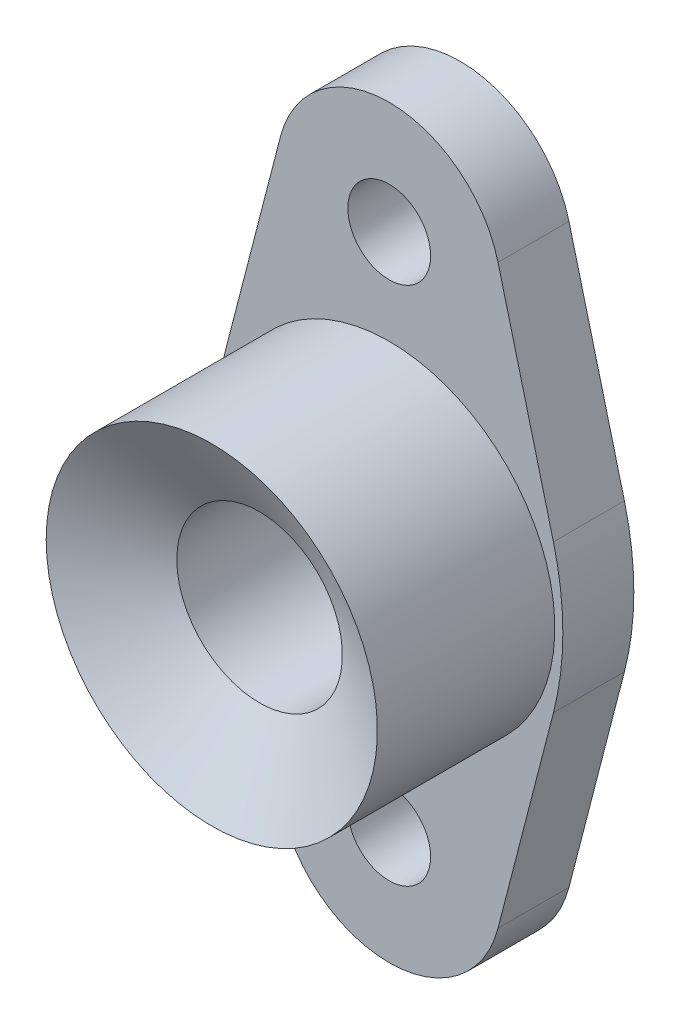
ISO-10303-21;
HEADER;
FILE_DESCRIPTION(('STEP AP214'),'2;1');
FILE_NAME('part.step','',(''),(''),'','','');
FILE_SCHEMA(('AUTOMOTIVE_DESIGN { 1 0 10303 214 1 1 1 1 }'));
ENDSEC;
DATA;
#1=APPLICATION_CONTEXT('core data for automotive mechanical design processes');
#2=APPLICATION_PROTOCOL_DEFINITION('international standard','automotive_design',2000,#1);
#3=PRODUCT_CONTEXT('',#1,'mechanical');
#4=PRODUCT('Part','Part','',(#3));
#5=PRODUCT_RELATED_PRODUCT_CATEGORY('part','',(#4));
#6=PRODUCT_DEFINITION_FORMATION('','',#4);
#7=PRODUCT_DEFINITION_CONTEXT('part definition',#1,'design');
#8=PRODUCT_DEFINITION('design','',#6,#7);
#9=PRODUCT_DEFINITION_SHAPE('','',#8);
#10=(LENGTH_UNIT() NAMED_UNIT(*) SI_UNIT(.MILLI.,.METRE.));
#11=(NAMED_UNIT(*) PLANE_ANGLE_UNIT() SI_UNIT($,.RADIAN.));
#12=(NAMED_UNIT(*) SI_UNIT($,.STERADIAN.) SOLID_ANGLE_UNIT());
#13=UNCERTAINTY_MEASURE_WITH_UNIT(LENGTH_MEASURE(1.E-05),#10,'distance_accuracy_value','');
#14=(GEOMETRIC_REPRESENTATION_CONTEXT(3) GLOBAL_UNCERTAINTY_ASSIGNED_CONTEXT((#13)) GLOBAL_UNIT_ASSIGNED_CONTEXT((#10,
#11,#12)) REPRESENTATION_CONTEXT('',''));
#15=CARTESIAN_POINT('',(0.,0.,0.));
#16=DIRECTION('',(0.,0.,1.));
#17=DIRECTION('',(1.,0.,0.));
#18=AXIS2_PLACEMENT_3D('',#15,#16,#17);
#19=CARTESIAN_POINT('',(0.,44.,12.));
#20=DIRECTION('',(0.,0.,1.));
#21=DIRECTION('',(1.,0.,0.));
#22=AXIS2_PLACEMENT_3D('',#19,#20,#21);
#23=PLANE('',#22);
#24=CARTESIAN_POINT('',(0.,0.,12.));
#25=DIRECTION('',(0.,0.,-1.));
#26=DIRECTION('',(-1.,0.,0.));
#27=AXIS2_PLACEMENT_3D('',#24,#25,#26);
#28=CIRCLE('',#27,28.);
#29=CARTESIAN_POINT('',(-28.,0.,12.));
#30=VERTEX_POINT('',#29);
#31=EDGE_CURVE('E190',#30,#30,#28,.T.);
#32=ORIENTED_EDGE('',*,*,#31,.T.);
#33=EDGE_LOOP('',(#32));
#34=FACE_BOUND('',#33,.T.);
#35=CARTESIAN_POINT('',(0.,-44.,12.));
#36=DIRECTION('',(0.,0.,1.));
#37=DIRECTION('',(1.,0.,0.));
#38=AXIS2_PLACEMENT_3D('',#35,#36,#37);
#39=CIRCLE('',#38,7.);
#40=CARTESIAN_POINT('',(7.00000000000001,-44.,12.));
#41=VERTEX_POINT('',#40);
#42=EDGE_CURVE('E179',#41,#41,#39,.T.);
#43=ORIENTED_EDGE('',*,*,#42,.F.);
#44=EDGE_LOOP('',(#43));
#45=FACE_BOUND('',#44,.T.);
#46=DIRECTION('',(-0.250300348874614,-0.968168237112356,0.));
#47=VECTOR('',#46,1.);
#48=CARTESIAN_POINT('',(-18.3951965051348,48.7557066286177,12.));
#49=LINE('',#48,#47);
#50=CARTESIAN_POINT('',(-18.3951965051348,48.7557066286177,12.));
#51=VERTEX_POINT('',#50);
#52=CARTESIAN_POINT('',(-27.7644949376973,12.5150174437307,12.));
#53=VERTEX_POINT('',#52);
#54=EDGE_CURVE('E98',#51,#53,#49,.T.);
#55=ORIENTED_EDGE('',*,*,#54,.T.);
#56=CARTESIAN_POINT('',(20.6439169179205,0.,12.));
#57=DIRECTION('',(0.,0.,1.));
#58=DIRECTION('',(1.,0.,0.));
#59=AXIS2_PLACEMENT_3D('',#56,#57,#58);
#60=CIRCLE('',#59,50.);
#61=CARTESIAN_POINT('',(-27.7644949376973,-12.5150174437307,12.));
#62=VERTEX_POINT('',#61);
#63=EDGE_CURVE('E138',#53,#62,#60,.T.);
#64=ORIENTED_EDGE('',*,*,#63,.T.);
#65=DIRECTION('',(0.250300348874614,-0.968168237112356,0.));
#66=VECTOR('',#65,1.);
#67=CARTESIAN_POINT('',(-31.,0.,12.));
#68=LINE('',#67,#66);
#69=CARTESIAN_POINT('',(-18.3951965051347,-48.7557066286177,12.));
#70=VERTEX_POINT('',#69);
#71=EDGE_CURVE('E108',#62,#70,#68,.T.);
#72=ORIENTED_EDGE('',*,*,#71,.T.);
#73=CARTESIAN_POINT('',(0.,-44.,12.));
#74=DIRECTION('',(0.,0.,1.));
#75=DIRECTION('',(1.,0.,0.));
#76=AXIS2_PLACEMENT_3D('',#73,#74,#75);
#77=CIRCLE('',#76,19.);
#78=CARTESIAN_POINT('',(18.3951965051348,-48.7557066286177,12.));
#79=VERTEX_POINT('',#78);
#80=EDGE_CURVE('E173',#70,#79,#77,.T.);
#81=ORIENTED_EDGE('',*,*,#80,.T.);
#82=DIRECTION('',(0.250300348874614,0.968168237112356,0.));
#83=VECTOR('',#82,1.);
#84=CARTESIAN_POINT('',(31.,0.,12.));
#85=LINE('',#84,#83);
#86=CARTESIAN_POINT('',(27.7644949376973,-12.5150174437307,12.));
#87=VERTEX_POINT('',#86);
#88=EDGE_CURVE('E160',#79,#87,#85,.T.);
#89=ORIENTED_EDGE('',*,*,#88,.T.);
#90=CARTESIAN_POINT('',(-20.6439169179204,0.,12.));
#91=DIRECTION('',(0.,0.,1.));
#92=DIRECTION('',(1.,0.,0.));
#93=AXIS2_PLACEMENT_3D('',#90,#91,#92);
#94=CIRCLE('',#93,50.);
#95=CARTESIAN_POINT('',(27.7644949376973,12.5150174437307,12.));
#96=VERTEX_POINT('',#95);
#97=EDGE_CURVE('E48',#87,#96,#94,.T.);
#98=ORIENTED_EDGE('',*,*,#97,.T.);
#99=DIRECTION('',(-0.250300348874614,0.968168237112356,0.));
#100=VECTOR('',#99,1.);
#101=CARTESIAN_POINT('',(18.3951965051348,48.7557066286177,12.));
#102=LINE('',#101,#100);
#103=CARTESIAN_POINT('',(18.3951965051348,48.7557066286177,12.));
#104=VERTEX_POINT('',#103);
#105=EDGE_CURVE('E113',#96,#104,#102,.T.);
#106=ORIENTED_EDGE('',*,*,#105,.T.);
#107=CARTESIAN_POINT('',(0.,44.,12.));
#108=DIRECTION('',(0.,0.,1.));
#109=DIRECTION('',(1.,0.,0.));
#110=AXIS2_PLACEMENT_3D('',#107,#108,#109);
#111=CIRCLE('',#110,19.);
#112=EDGE_CURVE('E109',#104,#51,#111,.T.);
#113=ORIENTED_EDGE('',*,*,#112,.T.);
#114=EDGE_LOOP('',(#55,#64,#72,#81,#89,#98,#106,#113));
#115=FACE_BOUND('',#114,.T.);
#116=CARTESIAN_POINT('',(0.,44.,12.));
#117=DIRECTION('',(0.,0.,1.));
#118=DIRECTION('',(1.,0.,0.));
#119=AXIS2_PLACEMENT_3D('',#116,#117,#118);
#120=CIRCLE('',#119,7.);
#121=CARTESIAN_POINT('',(7.,44.,12.));
#122=VERTEX_POINT('',#121);
#123=EDGE_CURVE('E170',#122,#122,#120,.T.);
#124=ORIENTED_EDGE('',*,*,#123,.F.);
#125=EDGE_LOOP('',(#124));
#126=FACE_BOUND('',#125,.T.);
#127=ADVANCED_FACE('F33',(#34,#45,#115,#126),#23,.T.);
#128=CARTESIAN_POINT('',(0.,44.,0.));
#129=DIRECTION('',(0.,0.,1.));
#130=DIRECTION('',(1.,0.,0.));
#131=AXIS2_PLACEMENT_3D('',#128,#129,#130);
#132=PLANE('',#131);
#133=DIRECTION('',(0.250300348874614,-0.968168237112356,0.));
#134=VECTOR('',#133,1.);
#135=CARTESIAN_POINT('',(-31.,0.,0.));
#136=LINE('',#135,#134);
#137=CARTESIAN_POINT('',(-27.7644949376973,-12.5150174437307,0.));
#138=VERTEX_POINT('',#137);
#139=CARTESIAN_POINT('',(-18.3951965051347,-48.7557066286177,0.));
#140=VERTEX_POINT('',#139);
#141=EDGE_CURVE('E164',#138,#140,#136,.T.);
#142=ORIENTED_EDGE('',*,*,#141,.F.);
#143=CARTESIAN_POINT('',(20.6439169179205,0.,0.));
#144=DIRECTION('',(0.,0.,1.));
#145=DIRECTION('',(1.,0.,0.));
#146=AXIS2_PLACEMENT_3D('',#143,#144,#145);
#147=CIRCLE('',#146,50.);
#148=CARTESIAN_POINT('',(-27.7644949376973,12.5150174437307,0.));
#149=VERTEX_POINT('',#148);
#150=EDGE_CURVE('E134',#138,#149,#147,.F.);
#151=ORIENTED_EDGE('',*,*,#150,.T.);
#152=DIRECTION('',(-0.250300348874614,-0.968168237112356,0.));
#153=VECTOR('',#152,1.);
#154=CARTESIAN_POINT('',(-18.3951965051348,48.7557066286177,0.));
#155=LINE('',#154,#153);
#156=CARTESIAN_POINT('',(-18.3951965051348,48.7557066286177,0.));
#157=VERTEX_POINT('',#156);
#158=EDGE_CURVE('E165',#157,#149,#155,.T.);
#159=ORIENTED_EDGE('',*,*,#158,.F.);
#160=CARTESIAN_POINT('',(0.,44.,0.));
#161=DIRECTION('',(0.,0.,1.));
#162=DIRECTION('',(1.,0.,0.));
#163=AXIS2_PLACEMENT_3D('',#160,#161,#162);
#164=CIRCLE('',#163,19.);
#165=CARTESIAN_POINT('',(18.3951965051348,48.7557066286177,0.));
#166=VERTEX_POINT('',#165);
#167=EDGE_CURVE('E121',#166,#157,#164,.T.);
#168=ORIENTED_EDGE('',*,*,#167,.F.);
#169=DIRECTION('',(-0.250300348874614,0.968168237112356,0.));
#170=VECTOR('',#169,1.);
#171=CARTESIAN_POINT('',(18.3951965051348,48.7557066286177,0.));
#172=LINE('',#171,#170);
#173=CARTESIAN_POINT('',(27.7644949376973,12.5150174437307,0.));
#174=VERTEX_POINT('',#173);
#175=EDGE_CURVE('E117',#174,#166,#172,.T.);
#176=ORIENTED_EDGE('',*,*,#175,.F.);
#177=CARTESIAN_POINT('',(-20.6439169179204,0.,0.));
#178=DIRECTION('',(0.,0.,1.));
#179=DIRECTION('',(1.,0.,0.));
#180=AXIS2_PLACEMENT_3D('',#177,#178,#179);
#181=CIRCLE('',#180,50.);
#182=CARTESIAN_POINT('',(27.7644949376973,-12.5150174437307,0.));
#183=VERTEX_POINT('',#182);
#184=EDGE_CURVE('E126',#174,#183,#181,.F.);
#185=ORIENTED_EDGE('',*,*,#184,.T.);
#186=DIRECTION('',(0.250300348874614,0.968168237112356,0.));
#187=VECTOR('',#186,1.);
#188=CARTESIAN_POINT('',(31.,0.,0.));
#189=LINE('',#188,#187);
#190=CARTESIAN_POINT('',(18.3951965051348,-48.7557066286177,0.));
#191=VERTEX_POINT('',#190);
#192=EDGE_CURVE('E150',#191,#183,#189,.T.);
#193=ORIENTED_EDGE('',*,*,#192,.F.);
#194=CARTESIAN_POINT('',(0.,-44.,0.));
#195=DIRECTION('',(0.,0.,1.));
#196=DIRECTION('',(1.,0.,0.));
#197=AXIS2_PLACEMENT_3D('',#194,#195,#196);
#198=CIRCLE('',#197,19.);
#199=EDGE_CURVE('E152',#140,#191,#198,.T.);
#200=ORIENTED_EDGE('',*,*,#199,.F.);
#201=EDGE_LOOP('',(#142,#151,#159,#168,#176,#185,#193,#200));
#202=FACE_BOUND('',#201,.T.);
#203=CARTESIAN_POINT('',(0.,44.,0.));
#204=DIRECTION('',(0.,0.,1.));
#205=DIRECTION('',(1.,0.,0.));
#206=AXIS2_PLACEMENT_3D('',#203,#204,#205);
#207=CIRCLE('',#206,7.);
#208=CARTESIAN_POINT('',(7.,44.,0.));
#209=VERTEX_POINT('',#208);
#210=EDGE_CURVE('E176',#209,#209,#207,.T.);
#211=ORIENTED_EDGE('',*,*,#210,.T.);
#212=EDGE_LOOP('',(#211));
#213=FACE_BOUND('',#212,.T.);
#214=CARTESIAN_POINT('',(0.,-44.,0.));
#215=DIRECTION('',(0.,0.,1.));
#216=DIRECTION('',(1.,0.,0.));
#217=AXIS2_PLACEMENT_3D('',#214,#215,#216);
#218=CIRCLE('',#217,7.);
#219=CARTESIAN_POINT('',(7.00000000000001,-44.,0.));
#220=VERTEX_POINT('',#219);
#221=EDGE_CURVE('E182',#220,#220,#218,.T.);
#222=ORIENTED_EDGE('',*,*,#221,.T.);
#223=EDGE_LOOP('',(#222));
#224=FACE_BOUND('',#223,.T.);
#225=CARTESIAN_POINT('',(0.,0.,0.));
#226=DIRECTION('',(0.,0.,1.));
#227=DIRECTION('',(1.,0.,0.));
#228=AXIS2_PLACEMENT_3D('',#225,#226,#227);
#229=CIRCLE('',#228,14.);
#230=CARTESIAN_POINT('',(14.,0.,0.));
#231=VERTEX_POINT('',#230);
#232=EDGE_CURVE('E185',#231,#231,#229,.T.);
#233=ORIENTED_EDGE('',*,*,#232,.T.);
#234=EDGE_LOOP('',(#233));
#235=FACE_BOUND('',#234,.T.);
#236=ADVANCED_FACE('F147',(#202,#213,#224,#235),#132,.F.);
#237=CARTESIAN_POINT('',(0.,44.,12.));
#238=DIRECTION('',(0.,0.,-1.));
#239=DIRECTION('',(-1.,0.,0.));
#240=AXIS2_PLACEMENT_3D('',#237,#238,#239);
#241=CYLINDRICAL_SURFACE('',#240,19.);
#242=ORIENTED_EDGE('',*,*,#167,.T.);
#243=DIRECTION('',(0.,0.,-1.));
#244=VECTOR('',#243,1.);
#245=CARTESIAN_POINT('',(-18.3951965051348,48.7557066286177,12.));
#246=LINE('',#245,#244);
#247=EDGE_CURVE('E103',#51,#157,#246,.T.);
#248=ORIENTED_EDGE('',*,*,#247,.F.);
#249=ORIENTED_EDGE('',*,*,#112,.F.);
#250=DIRECTION('',(0.,0.,-1.));
#251=VECTOR('',#250,1.);
#252=CARTESIAN_POINT('',(18.3951965051348,48.7557066286177,12.));
#253=LINE('',#252,#251);
#254=EDGE_CURVE('E156',#104,#166,#253,.T.);
#255=ORIENTED_EDGE('',*,*,#254,.T.);
#256=EDGE_LOOP('',(#242,#248,#249,#255));
#257=FACE_BOUND('',#256,.T.);
#258=ADVANCED_FACE('F119',(#257),#241,.T.);
#259=CARTESIAN_POINT('',(-18.3951965051348,48.7557066286177,12.));
#260=DIRECTION('',(0.968168237112356,-0.250300348874614,0.));
#261=DIRECTION('',(0.250300348874614,0.968168237112356,0.));
#262=AXIS2_PLACEMENT_3D('',#259,#260,#261);
#263=PLANE('',#262);
#264=ORIENTED_EDGE('',*,*,#158,.T.);
#265=DIRECTION('',(0.,0.,-1.));
#266=VECTOR('',#265,1.);
#267=CARTESIAN_POINT('',(-27.7644949376973,12.5150174437307,12.));
#268=LINE('',#267,#266);
#269=EDGE_CURVE('E106',#149,#53,#268,.F.);
#270=ORIENTED_EDGE('',*,*,#269,.T.);
#271=ORIENTED_EDGE('',*,*,#54,.F.);
#272=ORIENTED_EDGE('',*,*,#247,.T.);
#273=EDGE_LOOP('',(#264,#270,#271,#272));
#274=FACE_BOUND('',#273,.T.);
#275=ADVANCED_FACE('F101',(#274),#263,.F.);
#276=CARTESIAN_POINT('',(-31.,0.,12.));
#277=DIRECTION('',(0.968168237112356,0.250300348874614,0.));
#278=DIRECTION('',(-0.250300348874614,0.968168237112356,0.));
#279=AXIS2_PLACEMENT_3D('',#276,#277,#278);
#280=PLANE('',#279);
#281=ORIENTED_EDGE('',*,*,#71,.F.);
#282=DIRECTION('',(0.,0.,-1.));
#283=VECTOR('',#282,1.);
#284=CARTESIAN_POINT('',(-27.7644949376973,-12.5150174437307,12.));
#285=LINE('',#284,#283);
#286=EDGE_CURVE('E122',#62,#138,#285,.T.);
#287=ORIENTED_EDGE('',*,*,#286,.T.);
#288=ORIENTED_EDGE('',*,*,#141,.T.);
#289=DIRECTION('',(0.,0.,-1.));
#290=VECTOR('',#289,1.);
#291=CARTESIAN_POINT('',(-18.3951965051347,-48.7557066286177,12.));
#292=LINE('',#291,#290);
#293=EDGE_CURVE('E123',#70,#140,#292,.T.);
#294=ORIENTED_EDGE('',*,*,#293,.F.);
#295=EDGE_LOOP('',(#281,#287,#288,#294));
#296=FACE_BOUND('',#295,.T.);
#297=ADVANCED_FACE('F235',(#296),#280,.F.);
#298=CARTESIAN_POINT('',(0.,-44.,12.));
#299=DIRECTION('',(0.,0.,-1.));
#300=DIRECTION('',(-1.,0.,0.));
#301=AXIS2_PLACEMENT_3D('',#298,#299,#300);
#302=CYLINDRICAL_SURFACE('',#301,19.);
#303=ORIENTED_EDGE('',*,*,#199,.T.);
#304=DIRECTION('',(0.,0.,-1.));
#305=VECTOR('',#304,1.);
#306=CARTESIAN_POINT('',(18.3951965051348,-48.7557066286177,12.));
#307=LINE('',#306,#305);
#308=EDGE_CURVE('E129',#79,#191,#307,.T.);
#309=ORIENTED_EDGE('',*,*,#308,.F.);
#310=ORIENTED_EDGE('',*,*,#80,.F.);
#311=ORIENTED_EDGE('',*,*,#293,.T.);
#312=EDGE_LOOP('',(#303,#309,#310,#311));
#313=FACE_BOUND('',#312,.T.);
#314=ADVANCED_FACE('F232',(#313),#302,.T.);
#315=CARTESIAN_POINT('',(31.,0.,12.));
#316=DIRECTION('',(-0.968168237112356,0.250300348874614,0.));
#317=DIRECTION('',(-0.250300348874614,-0.968168237112356,0.));
#318=AXIS2_PLACEMENT_3D('',#315,#316,#317);
#319=PLANE('',#318);
#320=ORIENTED_EDGE('',*,*,#192,.T.);
#321=DIRECTION('',(0.,0.,-1.));
#322=VECTOR('',#321,1.);
#323=CARTESIAN_POINT('',(27.7644949376973,-12.5150174437307,12.));
#324=LINE('',#323,#322);
#325=EDGE_CURVE('E11',#183,#87,#324,.F.);
#326=ORIENTED_EDGE('',*,*,#325,.T.);
#327=ORIENTED_EDGE('',*,*,#88,.F.);
#328=ORIENTED_EDGE('',*,*,#308,.T.);
#329=EDGE_LOOP('',(#320,#326,#327,#328));
#330=FACE_BOUND('',#329,.T.);
#331=ADVANCED_FACE('F159',(#330),#319,.F.);
#332=CARTESIAN_POINT('',(18.3951965051348,48.7557066286177,12.));
#333=DIRECTION('',(-0.968168237112356,-0.250300348874614,0.));
#334=DIRECTION('',(0.250300348874614,-0.968168237112356,0.));
#335=AXIS2_PLACEMENT_3D('',#332,#333,#334);
#336=PLANE('',#335);
#337=ORIENTED_EDGE('',*,*,#105,.F.);
#338=DIRECTION('',(0.,0.,-1.));
#339=VECTOR('',#338,1.);
#340=CARTESIAN_POINT('',(27.7644949376973,12.5150174437307,12.));
#341=LINE('',#340,#339);
#342=EDGE_CURVE('E41',#96,#174,#341,.T.);
#343=ORIENTED_EDGE('',*,*,#342,.T.);
#344=ORIENTED_EDGE('',*,*,#175,.T.);
#345=ORIENTED_EDGE('',*,*,#254,.F.);
#346=EDGE_LOOP('',(#337,#343,#344,#345));
#347=FACE_BOUND('',#346,.T.);
#348=ADVANCED_FACE('F143',(#347),#336,.F.);
#349=CARTESIAN_POINT('',(0.,44.,12.));
#350=DIRECTION('',(0.,0.,-1.));
#351=DIRECTION('',(-1.,0.,0.));
#352=AXIS2_PLACEMENT_3D('',#349,#350,#351);
#353=CYLINDRICAL_SURFACE('',#352,7.);
#354=ORIENTED_EDGE('',*,*,#123,.T.);
#355=EDGE_LOOP('',(#354));
#356=FACE_BOUND('',#355,.T.);
#357=ORIENTED_EDGE('',*,*,#210,.F.);
#358=EDGE_LOOP('',(#357));
#359=FACE_BOUND('',#358,.T.);
#360=ADVANCED_FACE('F213',(#356,#359),#353,.F.);
#361=CARTESIAN_POINT('',(0.,-44.,12.));
#362=DIRECTION('',(0.,0.,-1.));
#363=DIRECTION('',(-1.,0.,0.));
#364=AXIS2_PLACEMENT_3D('',#361,#362,#363);
#365=CYLINDRICAL_SURFACE('',#364,7.);
#366=ORIENTED_EDGE('',*,*,#42,.T.);
#367=EDGE_LOOP('',(#366));
#368=FACE_BOUND('',#367,.T.);
#369=ORIENTED_EDGE('',*,*,#221,.F.);
#370=EDGE_LOOP('',(#369));
#371=FACE_BOUND('',#370,.T.);
#372=ADVANCED_FACE('F205',(#368,#371),#365,.F.);
#373=CARTESIAN_POINT('',(0.,0.,12.));
#374=DIRECTION('',(0.,0.,-1.));
#375=DIRECTION('',(-1.,0.,0.));
#376=AXIS2_PLACEMENT_3D('',#373,#374,#375);
#377=CYLINDRICAL_SURFACE('',#376,14.);
#378=ORIENTED_EDGE('',*,*,#232,.F.);
#379=EDGE_LOOP('',(#378));
#380=FACE_BOUND('',#379,.T.);
#381=CARTESIAN_POINT('',(0.,0.,33.9170962313451));
#382=DIRECTION('',(0.,0.,-1.));
#383=DIRECTION('',(-1.,0.,0.));
#384=AXIS2_PLACEMENT_3D('',#381,#382,#383);
#385=CIRCLE('',#384,14.);
#386=CARTESIAN_POINT('',(-14.,0.,33.9170962313451));
#387=VERTEX_POINT('',#386);
#388=EDGE_CURVE('E196',#387,#387,#385,.T.);
#389=ORIENTED_EDGE('',*,*,#388,.F.);
#390=EDGE_LOOP('',(#389));
#391=FACE_BOUND('',#390,.T.);
#392=ADVANCED_FACE('F202',(#380,#391),#377,.F.);
#393=CARTESIAN_POINT('',(20.6439169179205,0.,12.));
#394=DIRECTION('',(0.,0.,-1.));
#395=DIRECTION('',(-1.,0.,0.));
#396=AXIS2_PLACEMENT_3D('',#393,#394,#395);
#397=CYLINDRICAL_SURFACE('',#396,50.);
#398=ORIENTED_EDGE('',*,*,#63,.F.);
#399=ORIENTED_EDGE('',*,*,#269,.F.);
#400=ORIENTED_EDGE('',*,*,#150,.F.);
#401=ORIENTED_EDGE('',*,*,#286,.F.);
#402=EDGE_LOOP('',(#398,#399,#400,#401));
#403=FACE_BOUND('',#402,.T.);
#404=ADVANCED_FACE('F204',(#403),#397,.T.);
#405=CARTESIAN_POINT('',(-20.6439169179204,0.,12.));
#406=DIRECTION('',(0.,0.,-1.));
#407=DIRECTION('',(-1.,0.,0.));
#408=AXIS2_PLACEMENT_3D('',#405,#406,#407);
#409=CYLINDRICAL_SURFACE('',#408,50.);
#410=ORIENTED_EDGE('',*,*,#97,.F.);
#411=ORIENTED_EDGE('',*,*,#325,.F.);
#412=ORIENTED_EDGE('',*,*,#184,.F.);
#413=ORIENTED_EDGE('',*,*,#342,.F.);
#414=EDGE_LOOP('',(#410,#411,#412,#413));
#415=FACE_BOUND('',#414,.T.);
#416=ADVANCED_FACE('F35',(#415),#409,.T.);
#417=CARTESIAN_POINT('',(0.,0.,-17.4198041926031));
#418=DIRECTION('',(0.,0.,-1.));
#419=DIRECTION('',(-1.,0.,0.));
#420=AXIS2_PLACEMENT_3D('',#417,#418,#419);
#421=CYLINDRICAL_SURFACE('',#420,28.);
#422=ORIENTED_EDGE('',*,*,#31,.F.);
#423=EDGE_LOOP('',(#422));
#424=FACE_BOUND('',#423,.T.);
#425=CARTESIAN_POINT('',(0.,0.,42.));
#426=DIRECTION('',(0.,0.,-1.));
#427=DIRECTION('',(-1.,0.,0.));
#428=AXIS2_PLACEMENT_3D('',#425,#426,#427);
#429=CIRCLE('',#428,28.);
#430=CARTESIAN_POINT('',(-28.,0.,42.));
#431=VERTEX_POINT('',#430);
#432=EDGE_CURVE('E193',#431,#431,#429,.T.);
#433=ORIENTED_EDGE('',*,*,#432,.T.);
#434=EDGE_LOOP('',(#433));
#435=FACE_BOUND('',#434,.T.);
#436=ADVANCED_FACE('F314',(#424,#435),#421,.T.);
#437=CARTESIAN_POINT('',(0.,0.,33.9170962313451));
#438=DIRECTION('',(0.,0.,1.));
#439=DIRECTION('',(1.,0.,0.));
#440=AXIS2_PLACEMENT_3D('',#437,#438,#439);
#441=CONICAL_SURFACE('',#440,14.,1.04719755119659);
#442=ORIENTED_EDGE('',*,*,#432,.F.);
#443=EDGE_LOOP('',(#442));
#444=FACE_BOUND('',#443,.T.);
#445=ORIENTED_EDGE('',*,*,#388,.T.);
#446=EDGE_LOOP('',(#445));
#447=FACE_BOUND('',#446,.T.);
#448=ADVANCED_FACE('F200',(#444,#447),#441,.F.);
#449=CLOSED_SHELL('',(#127,#236,#258,#275,#297,#314,#331,#348,#360,#372,#392,#404,#416,#436,#448));
#450=MANIFOLD_SOLID_BREP('B2',#449);
#451=ADVANCED_BREP_SHAPE_REPRESENTATION('',(#18,#450),#14);
#452=SHAPE_DEFINITION_REPRESENTATION(#9,#451);
ENDSEC;
END-ISO-10303-21;
